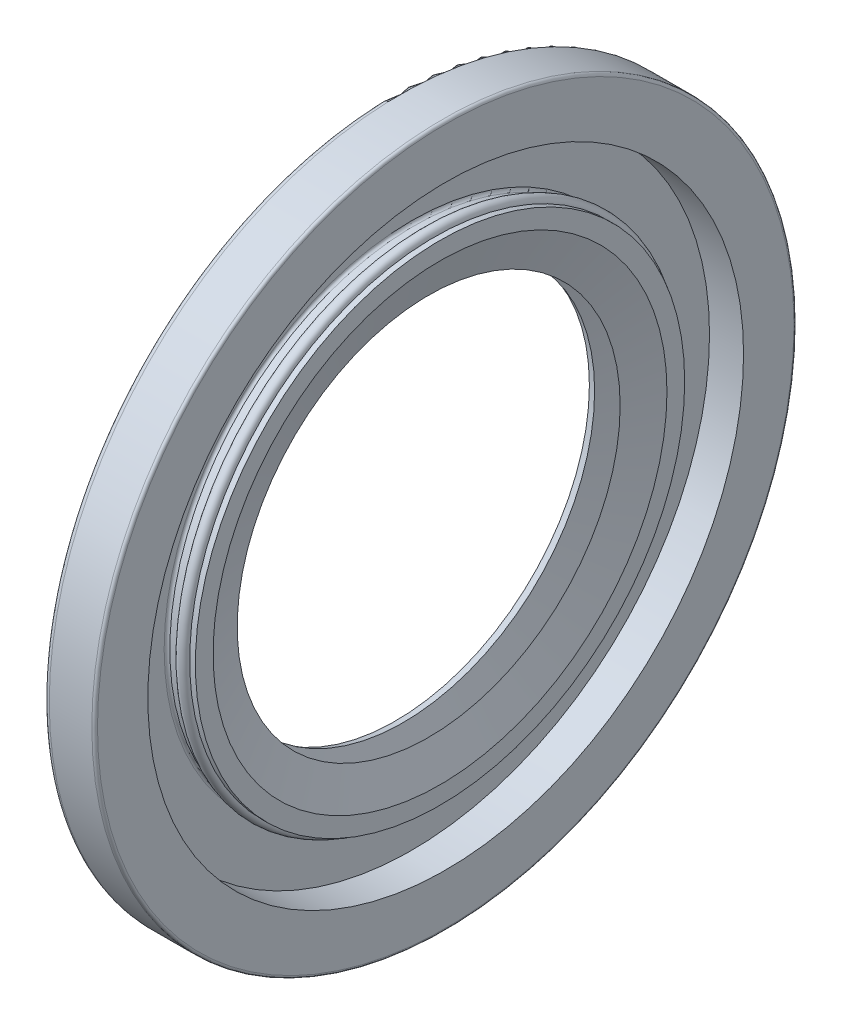
ISO-10303-21;
HEADER;
FILE_DESCRIPTION(('STEP AP214'),'2;1');
FILE_NAME('part.step','',(''),(''),'','','');
FILE_SCHEMA(('AUTOMOTIVE_DESIGN { 1 0 10303 214 1 1 1 1 }'));
ENDSEC;
DATA;
#1=APPLICATION_CONTEXT('core data for automotive mechanical design processes');
#2=APPLICATION_PROTOCOL_DEFINITION('international standard','automotive_design',2000,#1);
#3=PRODUCT_CONTEXT('',#1,'mechanical');
#4=PRODUCT('Part','Part','',(#3));
#5=PRODUCT_RELATED_PRODUCT_CATEGORY('part','',(#4));
#6=PRODUCT_DEFINITION_FORMATION('','',#4);
#7=PRODUCT_DEFINITION_CONTEXT('part definition',#1,'design');
#8=PRODUCT_DEFINITION('design','',#6,#7);
#9=PRODUCT_DEFINITION_SHAPE('','',#8);
#10=(LENGTH_UNIT() NAMED_UNIT(*) SI_UNIT(.MILLI.,.METRE.));
#11=(NAMED_UNIT(*) PLANE_ANGLE_UNIT() SI_UNIT($,.RADIAN.));
#12=(NAMED_UNIT(*) SI_UNIT($,.STERADIAN.) SOLID_ANGLE_UNIT());
#13=UNCERTAINTY_MEASURE_WITH_UNIT(LENGTH_MEASURE(1.E-05),#10,'distance_accuracy_value','');
#14=(GEOMETRIC_REPRESENTATION_CONTEXT(3) GLOBAL_UNCERTAINTY_ASSIGNED_CONTEXT((#13)) GLOBAL_UNIT_ASSIGNED_CONTEXT((#10,
#11,#12)) REPRESENTATION_CONTEXT('',''));
#15=CARTESIAN_POINT('',(0.,0.,0.));
#16=DIRECTION('',(0.,0.,1.));
#17=DIRECTION('',(1.,0.,0.));
#18=AXIS2_PLACEMENT_3D('',#15,#16,#17);
#19=CARTESIAN_POINT('',(0.,54.111111111111,0.));
#20=DIRECTION('',(-1.,0.,0.));
#21=DIRECTION('',(0.,0.,1.));
#22=AXIS2_PLACEMENT_3D('',#19,#20,#21);
#23=PLANE('',#22);
#24=CARTESIAN_POINT('',(0.,0.,0.));
#25=DIRECTION('',(1.,0.,0.));
#26=DIRECTION('',(0.,0.,-1.));
#27=AXIS2_PLACEMENT_3D('',#24,#25,#26);
#28=CIRCLE('',#27,46.666666666667);
#29=CARTESIAN_POINT('',(0.,0.,-46.666666666667));
#30=VERTEX_POINT('',#29);
#31=EDGE_CURVE('E86',#30,#30,#28,.T.);
#32=ORIENTED_EDGE('',*,*,#31,.T.);
#33=EDGE_LOOP('',(#32));
#34=FACE_BOUND('',#33,.T.);
#35=CARTESIAN_POINT('',(0.,0.,0.));
#36=DIRECTION('',(1.,0.,0.));
#37=DIRECTION('',(0.,0.,-1.));
#38=AXIS2_PLACEMENT_3D('',#35,#36,#37);
#39=CIRCLE('',#38,54.1111111111114);
#40=CARTESIAN_POINT('',(0.,0.,-54.1111111111114));
#41=VERTEX_POINT('',#40);
#42=EDGE_CURVE('E83',#41,#41,#39,.T.);
#43=ORIENTED_EDGE('',*,*,#42,.F.);
#44=EDGE_LOOP('',(#43));
#45=FACE_BOUND('',#44,.T.);
#46=ADVANCED_FACE('F15',(#34,#45),#23,.T.);
#47=CARTESIAN_POINT('',(8.,0.,0.));
#48=DIRECTION('',(1.,0.,0.));
#49=DIRECTION('',(0.,0.,-1.));
#50=AXIS2_PLACEMENT_3D('',#47,#48,#49);
#51=CYLINDRICAL_SURFACE('',#50,46.666666666667);
#52=CARTESIAN_POINT('',(0.2,0.,0.));
#53=DIRECTION('',(1.,0.,0.));
#54=DIRECTION('',(0.,0.,-1.));
#55=AXIS2_PLACEMENT_3D('',#52,#53,#54);
#56=CIRCLE('',#55,46.666666666667);
#57=CARTESIAN_POINT('',(0.2,0.,-46.666666666667));
#58=VERTEX_POINT('',#57);
#59=EDGE_CURVE('E80',#58,#58,#56,.T.);
#60=ORIENTED_EDGE('',*,*,#59,.T.);
#61=EDGE_LOOP('',(#60));
#62=FACE_BOUND('',#61,.T.);
#63=ORIENTED_EDGE('',*,*,#31,.F.);
#64=EDGE_LOOP('',(#63));
#65=FACE_BOUND('',#64,.T.);
#66=ADVANCED_FACE('F92',(#62,#65),#51,.F.);
#67=CARTESIAN_POINT('',(0.888888888888577,0.,0.));
#68=DIRECTION('',(1.,0.,0.));
#69=DIRECTION('',(0.,0.,-1.));
#70=AXIS2_PLACEMENT_3D('',#67,#68,#69);
#71=TOROIDAL_SURFACE('',#70,54.1111111111114,0.888888888888578);
#72=ORIENTED_EDGE('',*,*,#42,.T.);
#73=EDGE_LOOP('',(#72));
#74=FACE_BOUND('',#73,.T.);
#75=CARTESIAN_POINT('',(0.88888888888889,0.,0.));
#76=DIRECTION('',(1.,0.,0.));
#77=DIRECTION('',(0.,0.,-1.));
#78=AXIS2_PLACEMENT_3D('',#75,#76,#77);
#79=CIRCLE('',#78,55.);
#80=CARTESIAN_POINT('',(0.88888888888889,0.,-55.));
#81=VERTEX_POINT('',#80);
#82=EDGE_CURVE('E77',#81,#81,#79,.T.);
#83=ORIENTED_EDGE('',*,*,#82,.F.);
#84=EDGE_LOOP('',(#83));
#85=FACE_BOUND('',#84,.T.);
#86=ADVANCED_FACE('F94',(#74,#85),#71,.T.);
#87=CARTESIAN_POINT('',(0.2,46.666666666667,0.));
#88=DIRECTION('',(-1.,0.,0.));
#89=DIRECTION('',(0.,0.,1.));
#90=AXIS2_PLACEMENT_3D('',#87,#88,#89);
#91=PLANE('',#90);
#92=CARTESIAN_POINT('',(0.2,0.,0.));
#93=DIRECTION('',(1.,0.,0.));
#94=DIRECTION('',(0.,0.,-1.));
#95=AXIS2_PLACEMENT_3D('',#92,#93,#94);
#96=CIRCLE('',#95,38.333333333333);
#97=CARTESIAN_POINT('',(0.2,0.,-38.333333333333));
#98=VERTEX_POINT('',#97);
#99=EDGE_CURVE('E74',#98,#98,#96,.T.);
#100=ORIENTED_EDGE('',*,*,#99,.T.);
#101=EDGE_LOOP('',(#100));
#102=FACE_BOUND('',#101,.T.);
#103=ORIENTED_EDGE('',*,*,#59,.F.);
#104=EDGE_LOOP('',(#103));
#105=FACE_BOUND('',#104,.T.);
#106=ADVANCED_FACE('F102',(#102,#105),#91,.T.);
#107=CARTESIAN_POINT('',(8.,0.,0.));
#108=DIRECTION('',(1.,0.,0.));
#109=DIRECTION('',(0.,0.,-1.));
#110=AXIS2_PLACEMENT_3D('',#107,#108,#109);
#111=CYLINDRICAL_SURFACE('',#110,55.);
#112=ORIENTED_EDGE('',*,*,#82,.T.);
#113=EDGE_LOOP('',(#112));
#114=FACE_BOUND('',#113,.T.);
#115=CARTESIAN_POINT('',(7.5555555555556,0.,0.));
#116=DIRECTION('',(1.,0.,0.));
#117=DIRECTION('',(0.,0.,-1.));
#118=AXIS2_PLACEMENT_3D('',#115,#116,#117);
#119=CIRCLE('',#118,55.);
#120=CARTESIAN_POINT('',(7.5555555555556,0.,-55.));
#121=VERTEX_POINT('',#120);
#122=EDGE_CURVE('E71',#121,#121,#119,.T.);
#123=ORIENTED_EDGE('',*,*,#122,.F.);
#124=EDGE_LOOP('',(#123));
#125=FACE_BOUND('',#124,.T.);
#126=ADVANCED_FACE('F109',(#114,#125),#111,.T.);
#127=CARTESIAN_POINT('',(8.,0.,0.));
#128=DIRECTION('',(1.,0.,0.));
#129=DIRECTION('',(0.,0.,-1.));
#130=AXIS2_PLACEMENT_3D('',#127,#128,#129);
#131=CYLINDRICAL_SURFACE('',#130,38.333333333333);
#132=CARTESIAN_POINT('',(0.,0.,0.));
#133=DIRECTION('',(1.,0.,0.));
#134=DIRECTION('',(0.,0.,-1.));
#135=AXIS2_PLACEMENT_3D('',#132,#133,#134);
#136=CIRCLE('',#135,38.333333333333);
#137=CARTESIAN_POINT('',(0.,0.,-38.333333333333));
#138=VERTEX_POINT('',#137);
#139=EDGE_CURVE('E68',#138,#138,#136,.T.);
#140=ORIENTED_EDGE('',*,*,#139,.T.);
#141=EDGE_LOOP('',(#140));
#142=FACE_BOUND('',#141,.T.);
#143=ORIENTED_EDGE('',*,*,#99,.F.);
#144=EDGE_LOOP('',(#143));
#145=FACE_BOUND('',#144,.T.);
#146=ADVANCED_FACE('F113',(#142,#145),#131,.T.);
#147=CARTESIAN_POINT('',(7.5555555555557,0.,0.));
#148=DIRECTION('',(1.,0.,0.));
#149=DIRECTION('',(0.,0.,-1.));
#150=AXIS2_PLACEMENT_3D('',#147,#148,#149);
#151=TOROIDAL_SURFACE('',#150,54.5555555555557,0.444444444444303);
#152=ORIENTED_EDGE('',*,*,#122,.T.);
#153=EDGE_LOOP('',(#152));
#154=FACE_BOUND('',#153,.T.);
#155=CARTESIAN_POINT('',(8.,0.,0.));
#156=DIRECTION('',(1.,0.,0.));
#157=DIRECTION('',(0.,0.,-1.));
#158=AXIS2_PLACEMENT_3D('',#155,#156,#157);
#159=CIRCLE('',#158,54.5555556081221);
#160=CARTESIAN_POINT('',(8.,0.,-54.5555556081221));
#161=VERTEX_POINT('',#160);
#162=EDGE_CURVE('E65',#161,#161,#159,.T.);
#163=ORIENTED_EDGE('',*,*,#162,.F.);
#164=EDGE_LOOP('',(#163));
#165=FACE_BOUND('',#164,.T.);
#166=ADVANCED_FACE('F117',(#154,#165),#151,.T.);
#167=CARTESIAN_POINT('',(0.,38.333333333333,0.));
#168=DIRECTION('',(-1.,0.,0.));
#169=DIRECTION('',(0.,0.,1.));
#170=AXIS2_PLACEMENT_3D('',#167,#168,#169);
#171=PLANE('',#170);
#172=CARTESIAN_POINT('',(0.,0.,0.));
#173=DIRECTION('',(1.,0.,0.));
#174=DIRECTION('',(0.,0.,-1.));
#175=AXIS2_PLACEMENT_3D('',#172,#173,#174);
#176=CIRCLE('',#175,36.25);
#177=CARTESIAN_POINT('',(0.,0.,-36.25));
#178=VERTEX_POINT('',#177);
#179=EDGE_CURVE('E62',#178,#178,#176,.T.);
#180=ORIENTED_EDGE('',*,*,#179,.T.);
#181=EDGE_LOOP('',(#180));
#182=FACE_BOUND('',#181,.T.);
#183=ORIENTED_EDGE('',*,*,#139,.F.);
#184=EDGE_LOOP('',(#183));
#185=FACE_BOUND('',#184,.T.);
#186=ADVANCED_FACE('F121',(#182,#185),#171,.T.);
#187=CARTESIAN_POINT('',(8.,46.666666666667,0.));
#188=DIRECTION('',(1.,0.,0.));
#189=DIRECTION('',(0.,0.,-1.));
#190=AXIS2_PLACEMENT_3D('',#187,#188,#189);
#191=PLANE('',#190);
#192=ORIENTED_EDGE('',*,*,#162,.T.);
#193=EDGE_LOOP('',(#192));
#194=FACE_BOUND('',#193,.T.);
#195=CARTESIAN_POINT('',(8.,0.,0.));
#196=DIRECTION('',(1.,0.,0.));
#197=DIRECTION('',(0.,0.,-1.));
#198=AXIS2_PLACEMENT_3D('',#195,#196,#197);
#199=CIRCLE('',#198,46.666666666667);
#200=CARTESIAN_POINT('',(8.,0.,-46.666666666667));
#201=VERTEX_POINT('',#200);
#202=EDGE_CURVE('E59',#201,#201,#199,.T.);
#203=ORIENTED_EDGE('',*,*,#202,.F.);
#204=EDGE_LOOP('',(#203));
#205=FACE_BOUND('',#204,.T.);
#206=ADVANCED_FACE('F125',(#194,#205),#191,.T.);
#207=CARTESIAN_POINT('',(0.,0.,0.));
#208=DIRECTION('',(-1.,0.,0.));
#209=DIRECTION('',(0.,0.,1.));
#210=AXIS2_PLACEMENT_3D('',#207,#208,#209);
#211=CONICAL_SURFACE('',#210,36.25,1.00148313569417);
#212=CARTESIAN_POINT('',(1.3333333333333,0.,0.));
#213=DIRECTION('',(1.,0.,0.));
#214=DIRECTION('',(0.,0.,-1.));
#215=AXIS2_PLACEMENT_3D('',#212,#213,#214);
#216=CIRCLE('',#215,34.166666666667);
#217=CARTESIAN_POINT('',(1.3333333333333,0.,-34.166666666667));
#218=VERTEX_POINT('',#217);
#219=EDGE_CURVE('E56',#218,#218,#216,.T.);
#220=ORIENTED_EDGE('',*,*,#219,.T.);
#221=EDGE_LOOP('',(#220));
#222=FACE_BOUND('',#221,.T.);
#223=ORIENTED_EDGE('',*,*,#179,.F.);
#224=EDGE_LOOP('',(#223));
#225=FACE_BOUND('',#224,.T.);
#226=ADVANCED_FACE('F129',(#222,#225),#211,.F.);
#227=CARTESIAN_POINT('',(8.,0.,0.));
#228=DIRECTION('',(1.,0.,0.));
#229=DIRECTION('',(0.,0.,-1.));
#230=AXIS2_PLACEMENT_3D('',#227,#228,#229);
#231=CYLINDRICAL_SURFACE('',#230,46.666666666667);
#232=ORIENTED_EDGE('',*,*,#202,.T.);
#233=EDGE_LOOP('',(#232));
#234=FACE_BOUND('',#233,.T.);
#235=CARTESIAN_POINT('',(2.6666666666667,0.,0.));
#236=DIRECTION('',(1.,0.,0.));
#237=DIRECTION('',(0.,0.,-1.));
#238=AXIS2_PLACEMENT_3D('',#235,#236,#237);
#239=CIRCLE('',#238,46.666666666667);
#240=CARTESIAN_POINT('',(2.6666666666667,0.,-46.666666666667));
#241=VERTEX_POINT('',#240);
#242=EDGE_CURVE('E53',#241,#241,#239,.T.);
#243=ORIENTED_EDGE('',*,*,#242,.F.);
#244=EDGE_LOOP('',(#243));
#245=FACE_BOUND('',#244,.T.);
#246=ADVANCED_FACE('F133',(#234,#245),#231,.F.);
#247=CARTESIAN_POINT('',(1.3333333333333,0.,0.));
#248=DIRECTION('',(1.,0.,0.));
#249=DIRECTION('',(0.,0.,-1.));
#250=AXIS2_PLACEMENT_3D('',#247,#248,#249);
#251=CONICAL_SURFACE('',#250,34.166666666667,1.26109338225251);
#252=CARTESIAN_POINT('',(0.12385099177552,0.,0.));
#253=DIRECTION('',(1.,0.,0.));
#254=DIRECTION('',(0.,0.,-1.));
#255=AXIS2_PLACEMENT_3D('',#252,#253,#254);
#256=CIRCLE('',#255,30.387034349298);
#257=CARTESIAN_POINT('',(0.12385099177552,0.,-30.387034349298));
#258=VERTEX_POINT('',#257);
#259=EDGE_CURVE('E50',#258,#258,#256,.T.);
#260=ORIENTED_EDGE('',*,*,#259,.T.);
#261=EDGE_LOOP('',(#260));
#262=FACE_BOUND('',#261,.T.);
#263=ORIENTED_EDGE('',*,*,#219,.F.);
#264=EDGE_LOOP('',(#263));
#265=FACE_BOUND('',#264,.T.);
#266=ADVANCED_FACE('F137',(#262,#265),#251,.T.);
#267=CARTESIAN_POINT('',(2.6666666666667,38.777777833333,0.));
#268=DIRECTION('',(1.,0.,0.));
#269=DIRECTION('',(0.,0.,-1.));
#270=AXIS2_PLACEMENT_3D('',#267,#268,#269);
#271=PLANE('',#270);
#272=ORIENTED_EDGE('',*,*,#242,.T.);
#273=EDGE_LOOP('',(#272));
#274=FACE_BOUND('',#273,.T.);
#275=CARTESIAN_POINT('',(2.6666666666667,0.,0.));
#276=DIRECTION('',(1.,0.,0.));
#277=DIRECTION('',(0.,0.,-1.));
#278=AXIS2_PLACEMENT_3D('',#275,#276,#277);
#279=CIRCLE('',#278,38.7777777855758);
#280=CARTESIAN_POINT('',(2.6666666666667,0.,-38.7777777855758));
#281=VERTEX_POINT('',#280);
#282=EDGE_CURVE('E47',#281,#281,#279,.T.);
#283=ORIENTED_EDGE('',*,*,#282,.F.);
#284=EDGE_LOOP('',(#283));
#285=FACE_BOUND('',#284,.T.);
#286=ADVANCED_FACE('F141',(#274,#285),#271,.T.);
#287=CARTESIAN_POINT('',(0.123850991775519,0.,0.));
#288=DIRECTION('',(-1.,0.,0.));
#289=DIRECTION('',(0.,0.,1.));
#290=AXIS2_PLACEMENT_3D('',#287,#288,#289);
#291=CONICAL_SURFACE('',#290,30.387034349298,0.309702944542089);
#292=CARTESIAN_POINT('',(1.3333333333333,0.,0.));
#293=DIRECTION('',(1.,0.,0.));
#294=DIRECTION('',(0.,0.,-1.));
#295=AXIS2_PLACEMENT_3D('',#292,#293,#294);
#296=CIRCLE('',#295,30.);
#297=CARTESIAN_POINT('',(1.3333333333333,0.,-30.));
#298=VERTEX_POINT('',#297);
#299=EDGE_CURVE('E44',#298,#298,#296,.T.);
#300=ORIENTED_EDGE('',*,*,#299,.T.);
#301=EDGE_LOOP('',(#300));
#302=FACE_BOUND('',#301,.T.);
#303=ORIENTED_EDGE('',*,*,#259,.F.);
#304=EDGE_LOOP('',(#303));
#305=FACE_BOUND('',#304,.T.);
#306=ADVANCED_FACE('F145',(#302,#305),#291,.F.);
#307=CARTESIAN_POINT('',(3.11111116666675,0.,0.));
#308=DIRECTION('',(1.,0.,0.));
#309=DIRECTION('',(0.,0.,-1.));
#310=AXIS2_PLACEMENT_3D('',#307,#308,#309);
#311=TOROIDAL_SURFACE('',#310,38.777777833333,0.444444500000058);
#312=CARTESIAN_POINT('',(3.1111111666667,0.,0.));
#313=DIRECTION('',(1.,0.,0.));
#314=DIRECTION('',(0.,0.,-1.));
#315=AXIS2_PLACEMENT_3D('',#312,#313,#314);
#316=CIRCLE('',#315,38.333333333333);
#317=CARTESIAN_POINT('',(3.1111111666667,0.,-38.333333333333));
#318=VERTEX_POINT('',#317);
#319=EDGE_CURVE('E41',#318,#318,#316,.T.);
#320=ORIENTED_EDGE('',*,*,#319,.F.);
#321=EDGE_LOOP('',(#320));
#322=FACE_BOUND('',#321,.T.);
#323=ORIENTED_EDGE('',*,*,#282,.T.);
#324=EDGE_LOOP('',(#323));
#325=FACE_BOUND('',#324,.T.);
#326=ADVANCED_FACE('F149',(#322,#325),#311,.F.);
#327=CARTESIAN_POINT('',(1.3333333333333,0.,0.));
#328=DIRECTION('',(1.,0.,0.));
#329=DIRECTION('',(0.,0.,-1.));
#330=AXIS2_PLACEMENT_3D('',#327,#328,#329);
#331=CONICAL_SURFACE('',#330,30.,1.26109338225245);
#332=CARTESIAN_POINT('',(2.6666666666667,0.,0.));
#333=DIRECTION('',(1.,0.,0.));
#334=DIRECTION('',(0.,0.,-1.));
#335=AXIS2_PLACEMENT_3D('',#332,#333,#334);
#336=CIRCLE('',#335,34.166666666667);
#337=CARTESIAN_POINT('',(2.6666666666667,0.,-34.166666666667));
#338=VERTEX_POINT('',#337);
#339=EDGE_CURVE('E38',#338,#338,#336,.T.);
#340=ORIENTED_EDGE('',*,*,#339,.T.);
#341=EDGE_LOOP('',(#340));
#342=FACE_BOUND('',#341,.T.);
#343=ORIENTED_EDGE('',*,*,#299,.F.);
#344=EDGE_LOOP('',(#343));
#345=FACE_BOUND('',#344,.T.);
#346=ADVANCED_FACE('F153',(#342,#345),#331,.F.);
#347=CARTESIAN_POINT('',(8.,0.,0.));
#348=DIRECTION('',(1.,0.,0.));
#349=DIRECTION('',(0.,0.,-1.));
#350=AXIS2_PLACEMENT_3D('',#347,#348,#349);
#351=CYLINDRICAL_SURFACE('',#350,38.333333333333);
#352=ORIENTED_EDGE('',*,*,#319,.T.);
#353=EDGE_LOOP('',(#352));
#354=FACE_BOUND('',#353,.T.);
#355=CARTESIAN_POINT('',(4.4444443333333,0.,0.));
#356=DIRECTION('',(1.,0.,0.));
#357=DIRECTION('',(0.,0.,-1.));
#358=AXIS2_PLACEMENT_3D('',#355,#356,#357);
#359=CIRCLE('',#358,38.333333333333);
#360=CARTESIAN_POINT('',(4.4444443333333,0.,-38.333333333333));
#361=VERTEX_POINT('',#360);
#362=EDGE_CURVE('E35',#361,#361,#359,.T.);
#363=ORIENTED_EDGE('',*,*,#362,.F.);
#364=EDGE_LOOP('',(#363));
#365=FACE_BOUND('',#364,.T.);
#366=ADVANCED_FACE('F157',(#354,#365),#351,.T.);
#367=CARTESIAN_POINT('',(2.6666666666667,0.,0.));
#368=DIRECTION('',(-1.,0.,0.));
#369=DIRECTION('',(0.,0.,1.));
#370=AXIS2_PLACEMENT_3D('',#367,#368,#369);
#371=CONICAL_SURFACE('',#370,34.166666666667,1.00148313569428);
#372=CARTESIAN_POINT('',(5.3333333333333,0.,0.));
#373=DIRECTION('',(1.,0.,0.));
#374=DIRECTION('',(0.,0.,-1.));
#375=AXIS2_PLACEMENT_3D('',#372,#373,#374);
#376=CIRCLE('',#375,30.);
#377=CARTESIAN_POINT('',(5.3333333333333,0.,-30.));
#378=VERTEX_POINT('',#377);
#379=EDGE_CURVE('E30',#378,#378,#376,.T.);
#380=ORIENTED_EDGE('',*,*,#379,.T.);
#381=EDGE_LOOP('',(#380));
#382=FACE_BOUND('',#381,.T.);
#383=ORIENTED_EDGE('',*,*,#339,.F.);
#384=EDGE_LOOP('',(#383));
#385=FACE_BOUND('',#384,.T.);
#386=ADVANCED_FACE('F161',(#382,#385),#371,.F.);
#387=CARTESIAN_POINT('',(5.3333333333333,0.,0.));
#388=DIRECTION('',(1.,0.,0.));
#389=DIRECTION('',(0.,0.,-1.));
#390=AXIS2_PLACEMENT_3D('',#387,#388,#389);
#391=TOROIDAL_SURFACE('',#390,38.333333333333,0.888889);
#392=ORIENTED_EDGE('',*,*,#362,.T.);
#393=EDGE_LOOP('',(#392));
#394=FACE_BOUND('',#393,.T.);
#395=CARTESIAN_POINT('',(6.2222223333333,0.,0.));
#396=DIRECTION('',(1.,0.,0.));
#397=DIRECTION('',(0.,0.,-1.));
#398=AXIS2_PLACEMENT_3D('',#395,#396,#397);
#399=CIRCLE('',#398,38.333333333333);
#400=CARTESIAN_POINT('',(6.2222223333333,0.,-38.333333333333));
#401=VERTEX_POINT('',#400);
#402=EDGE_CURVE('E26',#401,#401,#399,.T.);
#403=ORIENTED_EDGE('',*,*,#402,.F.);
#404=EDGE_LOOP('',(#403));
#405=FACE_BOUND('',#404,.T.);
#406=ADVANCED_FACE('F165',(#394,#405),#391,.T.);
#407=CARTESIAN_POINT('',(5.3333333333333,0.,0.));
#408=DIRECTION('',(1.,0.,0.));
#409=DIRECTION('',(0.,0.,-1.));
#410=AXIS2_PLACEMENT_3D('',#407,#408,#409);
#411=CONICAL_SURFACE('',#410,30.,1.26109338225245);
#412=CARTESIAN_POINT('',(7.1111111666667,0.,0.));
#413=DIRECTION('',(1.,0.,0.));
#414=DIRECTION('',(0.,0.,-1.));
#415=AXIS2_PLACEMENT_3D('',#412,#413,#414);
#416=CIRCLE('',#415,35.555555729167);
#417=CARTESIAN_POINT('',(7.1111111666667,0.,-35.555555729167));
#418=VERTEX_POINT('',#417);
#419=EDGE_CURVE('E22',#418,#418,#416,.T.);
#420=ORIENTED_EDGE('',*,*,#419,.T.);
#421=EDGE_LOOP('',(#420));
#422=FACE_BOUND('',#421,.T.);
#423=ORIENTED_EDGE('',*,*,#379,.F.);
#424=EDGE_LOOP('',(#423));
#425=FACE_BOUND('',#424,.T.);
#426=ADVANCED_FACE('F169',(#422,#425),#411,.F.);
#427=CARTESIAN_POINT('',(8.,0.,0.));
#428=DIRECTION('',(1.,0.,0.));
#429=DIRECTION('',(0.,0.,-1.));
#430=AXIS2_PLACEMENT_3D('',#427,#428,#429);
#431=CYLINDRICAL_SURFACE('',#430,38.333333333333);
#432=ORIENTED_EDGE('',*,*,#402,.T.);
#433=EDGE_LOOP('',(#432));
#434=FACE_BOUND('',#433,.T.);
#435=CARTESIAN_POINT('',(7.1111111666667,0.,0.));
#436=DIRECTION('',(1.,0.,0.));
#437=DIRECTION('',(0.,0.,-1.));
#438=AXIS2_PLACEMENT_3D('',#435,#436,#437);
#439=CIRCLE('',#438,38.333333333333);
#440=CARTESIAN_POINT('',(7.1111111666667,0.,-38.333333333333));
#441=VERTEX_POINT('',#440);
#442=EDGE_CURVE('E10',#441,#441,#439,.T.);
#443=ORIENTED_EDGE('',*,*,#442,.F.);
#444=EDGE_LOOP('',(#443));
#445=FACE_BOUND('',#444,.T.);
#446=ADVANCED_FACE('F172',(#434,#445),#431,.T.);
#447=CARTESIAN_POINT('',(7.1111111666667,35.555555729167,0.));
#448=DIRECTION('',(1.,0.,0.));
#449=DIRECTION('',(0.,0.,-1.));
#450=AXIS2_PLACEMENT_3D('',#447,#448,#449);
#451=PLANE('',#450);
#452=ORIENTED_EDGE('',*,*,#442,.T.);
#453=EDGE_LOOP('',(#452));
#454=FACE_BOUND('',#453,.T.);
#455=ORIENTED_EDGE('',*,*,#419,.F.);
#456=EDGE_LOOP('',(#455));
#457=FACE_BOUND('',#456,.T.);
#458=ADVANCED_FACE('F17',(#454,#457),#451,.T.);
#459=CLOSED_SHELL('',(#46,#66,#86,#106,#126,#146,#166,#186,#206,#226,#246,#266,#286,#306,#326,
#346,#366,#386,#406,#426,#446,#458));
#460=MANIFOLD_SOLID_BREP('B1',#459);
#461=ADVANCED_BREP_SHAPE_REPRESENTATION('',(#18,#460),#14);
#462=SHAPE_DEFINITION_REPRESENTATION(#9,#461);
ENDSEC;
END-ISO-10303-21;
